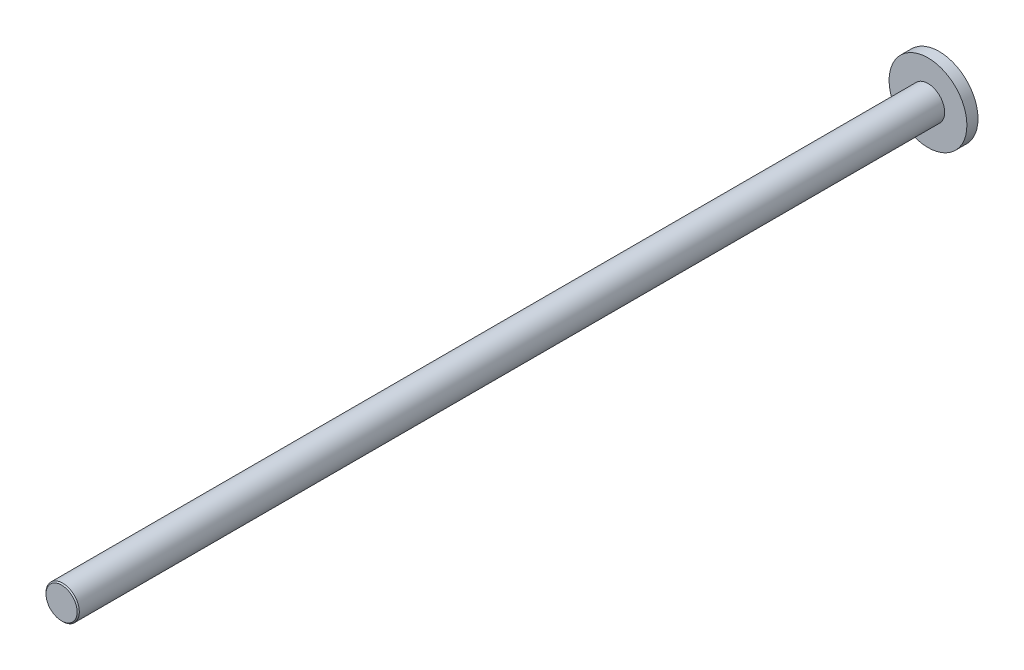
ISO-10303-21;
HEADER;
FILE_DESCRIPTION(('STEP AP214'),'2;1');
FILE_NAME('part.step','',(''),(''),'','','');
FILE_SCHEMA(('AUTOMOTIVE_DESIGN { 1 0 10303 214 1 1 1 1 }'));
ENDSEC;
DATA;
#1=APPLICATION_CONTEXT('core data for automotive mechanical design processes');
#2=APPLICATION_PROTOCOL_DEFINITION('international standard','automotive_design',2000,#1);
#3=PRODUCT_CONTEXT('',#1,'mechanical');
#4=PRODUCT('Part','Part','',(#3));
#5=PRODUCT_RELATED_PRODUCT_CATEGORY('part','',(#4));
#6=PRODUCT_DEFINITION_FORMATION('','',#4);
#7=PRODUCT_DEFINITION_CONTEXT('part definition',#1,'design');
#8=PRODUCT_DEFINITION('design','',#6,#7);
#9=PRODUCT_DEFINITION_SHAPE('','',#8);
#10=(LENGTH_UNIT() NAMED_UNIT(*) SI_UNIT(.MILLI.,.METRE.));
#11=(NAMED_UNIT(*) PLANE_ANGLE_UNIT() SI_UNIT($,.RADIAN.));
#12=(NAMED_UNIT(*) SI_UNIT($,.STERADIAN.) SOLID_ANGLE_UNIT());
#13=UNCERTAINTY_MEASURE_WITH_UNIT(LENGTH_MEASURE(1.E-05),#10,'distance_accuracy_value','');
#14=(GEOMETRIC_REPRESENTATION_CONTEXT(3) GLOBAL_UNCERTAINTY_ASSIGNED_CONTEXT((#13)) GLOBAL_UNIT_ASSIGNED_CONTEXT((#10,
#11,#12)) REPRESENTATION_CONTEXT('',''));
#15=CARTESIAN_POINT('',(0.,0.,0.));
#16=DIRECTION('',(0.,0.,1.));
#17=DIRECTION('',(1.,0.,0.));
#18=AXIS2_PLACEMENT_3D('',#15,#16,#17);
#19=CARTESIAN_POINT('',(0.,0.,1.));
#20=DIRECTION('',(0.,0.,-1.));
#21=DIRECTION('',(-1.,0.,0.));
#22=AXIS2_PLACEMENT_3D('',#19,#20,#21);
#23=CYLINDRICAL_SURFACE('',#22,3.5);
#24=CARTESIAN_POINT('',(0.,0.,1.));
#25=DIRECTION('',(0.,0.,1.));
#26=DIRECTION('',(1.,0.,0.));
#27=AXIS2_PLACEMENT_3D('',#24,#25,#26);
#28=CIRCLE('',#27,3.5);
#29=CARTESIAN_POINT('',(3.5,0.,1.));
#30=VERTEX_POINT('',#29);
#31=EDGE_CURVE('E74',#30,#30,#28,.T.);
#32=ORIENTED_EDGE('',*,*,#31,.F.);
#33=EDGE_LOOP('',(#32));
#34=FACE_BOUND('',#33,.T.);
#35=CARTESIAN_POINT('',(0.,0.,0.));
#36=DIRECTION('',(0.,0.,1.));
#37=DIRECTION('',(1.,0.,0.));
#38=AXIS2_PLACEMENT_3D('',#35,#36,#37);
#39=CIRCLE('',#38,3.5);
#40=CARTESIAN_POINT('',(3.5,0.,0.));
#41=VERTEX_POINT('',#40);
#42=EDGE_CURVE('E77',#41,#41,#39,.T.);
#43=ORIENTED_EDGE('',*,*,#42,.T.);
#44=EDGE_LOOP('',(#43));
#45=FACE_BOUND('',#44,.T.);
#46=ADVANCED_FACE('F51',(#34,#45),#23,.T.);
#47=CARTESIAN_POINT('',(0.,0.,1.));
#48=DIRECTION('',(0.,0.,1.));
#49=DIRECTION('',(1.,0.,0.));
#50=AXIS2_PLACEMENT_3D('',#47,#48,#49);
#51=PLANE('',#50);
#52=CARTESIAN_POINT('',(0.,0.,1.));
#53=DIRECTION('',(0.,0.,1.));
#54=DIRECTION('',(1.,0.,0.));
#55=AXIS2_PLACEMENT_3D('',#52,#53,#54);
#56=CIRCLE('',#55,1.5);
#57=CARTESIAN_POINT('',(1.5,0.,1.));
#58=VERTEX_POINT('',#57);
#59=EDGE_CURVE('E67',#58,#58,#56,.T.);
#60=ORIENTED_EDGE('',*,*,#59,.F.);
#61=EDGE_LOOP('',(#60));
#62=FACE_BOUND('',#61,.T.);
#63=ORIENTED_EDGE('',*,*,#31,.T.);
#64=EDGE_LOOP('',(#63));
#65=FACE_BOUND('',#64,.T.);
#66=ADVANCED_FACE('F84',(#62,#65),#51,.T.);
#67=CARTESIAN_POINT('',(0.,0.,0.));
#68=DIRECTION('',(0.,0.,1.));
#69=DIRECTION('',(1.,0.,0.));
#70=AXIS2_PLACEMENT_3D('',#67,#68,#69);
#71=PLANE('',#70);
#72=ORIENTED_EDGE('',*,*,#42,.F.);
#73=EDGE_LOOP('',(#72));
#74=FACE_BOUND('',#73,.T.);
#75=ADVANCED_FACE('F90',(#74),#71,.F.);
#76=CARTESIAN_POINT('',(-4.44089209850063E-13,0.,79.));
#77=DIRECTION('',(0.,0.,-1.));
#78=DIRECTION('',(-1.,0.,0.));
#79=AXIS2_PLACEMENT_3D('',#76,#77,#78);
#80=CYLINDRICAL_SURFACE('',#79,1.5);
#81=CARTESIAN_POINT('',(-4.44089209850063E-13,0.,78.9));
#82=DIRECTION('',(0.,0.,1.));
#83=DIRECTION('',(1.,0.,0.));
#84=AXIS2_PLACEMENT_3D('',#81,#82,#83);
#85=CIRCLE('',#84,1.5);
#86=CARTESIAN_POINT('',(-1.50000000000045,0.,78.9));
#87=VERTEX_POINT('',#86);
#88=EDGE_CURVE('E10',#87,#87,#85,.F.);
#89=ORIENTED_EDGE('',*,*,#88,.T.);
#90=EDGE_LOOP('',(#89));
#91=FACE_BOUND('',#90,.T.);
#92=ORIENTED_EDGE('',*,*,#59,.T.);
#93=EDGE_LOOP('',(#92));
#94=FACE_BOUND('',#93,.T.);
#95=ADVANCED_FACE('F92',(#91,#94),#80,.T.);
#96=CARTESIAN_POINT('',(-4.44089209850063E-13,0.,79.));
#97=DIRECTION('',(0.,0.,1.));
#98=DIRECTION('',(1.,0.,0.));
#99=AXIS2_PLACEMENT_3D('',#96,#97,#98);
#100=PLANE('',#99);
#101=CARTESIAN_POINT('',(-4.44089209850063E-13,0.,79.));
#102=DIRECTION('',(0.,0.,1.));
#103=DIRECTION('',(1.,0.,0.));
#104=AXIS2_PLACEMENT_3D('',#101,#102,#103);
#105=CIRCLE('',#104,1.40000000000001);
#106=CARTESIAN_POINT('',(-1.40000000000046,0.,79.));
#107=VERTEX_POINT('',#106);
#108=EDGE_CURVE('E60',#107,#107,#105,.T.);
#109=ORIENTED_EDGE('',*,*,#108,.T.);
#110=EDGE_LOOP('',(#109));
#111=FACE_BOUND('',#110,.T.);
#112=ADVANCED_FACE('F97',(#111),#100,.T.);
#113=CARTESIAN_POINT('',(-4.44089209850063E-13,0.,79.));
#114=DIRECTION('',(0.,0.,-1.));
#115=DIRECTION('',(-1.,0.,0.));
#116=AXIS2_PLACEMENT_3D('',#113,#114,#115);
#117=CONICAL_SURFACE('',#116,1.40000000000001,0.785398163397444);
#118=CARTESIAN_POINT('',(-1.50000000000045,0.,78.9));
#119=CARTESIAN_POINT('',(-1.49895833333379,0.,78.9010416666667));
#120=CARTESIAN_POINT('',(-1.49791666666712,0.,78.9020833333334));
#121=CARTESIAN_POINT('',(-1.49583333333378,0.,78.9041666666667));
#122=CARTESIAN_POINT('',(-1.49479166666712,0.,78.9052083333333));
#123=CARTESIAN_POINT('',(-1.49270833333378,0.,78.9072916666667));
#124=CARTESIAN_POINT('',(-1.49166666666712,0.,78.9083333333333));
#125=CARTESIAN_POINT('',(-1.48958333333379,0.,78.9104166666667));
#126=CARTESIAN_POINT('',(-1.48854166666712,0.,78.9114583333334));
#127=CARTESIAN_POINT('',(-1.48645833333379,0.,78.9135416666667));
#128=CARTESIAN_POINT('',(-1.48541666666712,0.,78.9145833333333));
#129=CARTESIAN_POINT('',(-1.48333333333379,0.,78.9166666666667));
#130=CARTESIAN_POINT('',(-1.48229166666712,0.,78.9177083333334));
#131=CARTESIAN_POINT('',(-1.48020833333379,0.,78.9197916666667));
#132=CARTESIAN_POINT('',(-1.47916666666712,0.,78.9208333333333));
#133=CARTESIAN_POINT('',(-1.47708333333379,0.,78.9229166666667));
#134=CARTESIAN_POINT('',(-1.47604166666712,0.,78.9239583333333));
#135=CARTESIAN_POINT('',(-1.47395833333379,0.,78.9260416666667));
#136=CARTESIAN_POINT('',(-1.47291666666712,0.,78.9270833333333));
#137=CARTESIAN_POINT('',(-1.47083333333379,0.,78.9291666666667));
#138=CARTESIAN_POINT('',(-1.46979166666712,0.,78.9302083333334));
#139=CARTESIAN_POINT('',(-1.46770833333379,0.,78.9322916666667));
#140=CARTESIAN_POINT('',(-1.46666666666712,0.,78.9333333333333));
#141=CARTESIAN_POINT('',(-1.46458333333379,0.,78.9354166666667));
#142=CARTESIAN_POINT('',(-1.46354166666712,0.,78.9364583333333));
#143=CARTESIAN_POINT('',(-1.46145833333379,0.,78.9385416666667));
#144=CARTESIAN_POINT('',(-1.46041666666712,0.,78.9395833333334));
#145=CARTESIAN_POINT('',(-1.45833333333379,0.,78.9416666666667));
#146=CARTESIAN_POINT('',(-1.45729166666712,0.,78.9427083333333));
#147=CARTESIAN_POINT('',(-1.45520833333379,0.,78.9447916666667));
#148=CARTESIAN_POINT('',(-1.45416666666712,0.,78.9458333333333));
#149=CARTESIAN_POINT('',(-1.45208333333379,0.,78.9479166666667));
#150=CARTESIAN_POINT('',(-1.45104166666712,0.,78.9489583333334));
#151=CARTESIAN_POINT('',(-1.44895833333379,0.,78.9510416666667));
#152=CARTESIAN_POINT('',(-1.44791666666713,0.,78.9520833333333));
#153=CARTESIAN_POINT('',(-1.44583333333379,0.,78.9541666666667));
#154=CARTESIAN_POINT('',(-1.44479166666712,0.,78.9552083333333));
#155=CARTESIAN_POINT('',(-1.44270833333379,0.,78.9572916666667));
#156=CARTESIAN_POINT('',(-1.44166666666713,0.,78.9583333333333));
#157=CARTESIAN_POINT('',(-1.43958333333379,0.,78.9604166666667));
#158=CARTESIAN_POINT('',(-1.43854166666712,0.,78.9614583333333));
#159=CARTESIAN_POINT('',(-1.43645833333379,0.,78.9635416666667));
#160=CARTESIAN_POINT('',(-1.43541666666713,0.,78.9645833333333));
#161=CARTESIAN_POINT('',(-1.43333333333379,0.,78.9666666666667));
#162=CARTESIAN_POINT('',(-1.43229166666713,0.,78.9677083333333));
#163=CARTESIAN_POINT('',(-1.43020833333379,0.,78.9697916666667));
#164=CARTESIAN_POINT('',(-1.42916666666713,0.,78.9708333333333));
#165=CARTESIAN_POINT('',(-1.42708333333379,0.,78.9729166666667));
#166=CARTESIAN_POINT('',(-1.42604166666713,0.,78.9739583333333));
#167=CARTESIAN_POINT('',(-1.42395833333379,0.,78.9760416666667));
#168=CARTESIAN_POINT('',(-1.42291666666713,0.,78.9770833333334));
#169=CARTESIAN_POINT('',(-1.42083333333379,0.,78.9791666666667));
#170=CARTESIAN_POINT('',(-1.41979166666713,0.,78.9802083333333));
#171=CARTESIAN_POINT('',(-1.4177083333338,0.,78.9822916666667));
#172=CARTESIAN_POINT('',(-1.41666666666713,0.,78.9833333333333));
#173=CARTESIAN_POINT('',(-1.41458333333379,0.,78.9854166666667));
#174=CARTESIAN_POINT('',(-1.41354166666713,0.,78.9864583333333));
#175=CARTESIAN_POINT('',(-1.4114583333338,0.,78.9885416666667));
#176=CARTESIAN_POINT('',(-1.41041666666713,0.,78.9895833333333));
#177=CARTESIAN_POINT('',(-1.40833333333379,0.,78.9916666666667));
#178=CARTESIAN_POINT('',(-1.40729166666713,0.,78.9927083333333));
#179=CARTESIAN_POINT('',(-1.4052083333338,0.,78.9947916666667));
#180=CARTESIAN_POINT('',(-1.40416666666713,0.,78.9958333333334));
#181=CARTESIAN_POINT('',(-1.40208333333379,0.,78.9979166666667));
#182=CARTESIAN_POINT('',(-1.40104166666713,0.,78.9989583333333));
#183=CARTESIAN_POINT('',(-1.40000000000046,0.,79.));
#184=B_SPLINE_CURVE_WITH_KNOTS('',3,(#118,#119,#120,#121,#122,#123,#124,#125,#126,#127,#128,
#129,#130,#131,#132,#133,#134,#135,#136,#137,#138,#139,#140,#141,#142,#143,#144,#145,#146,#147,
#148,#149,#150,#151,#152,#153,#154,#155,#156,#157,#158,#159,#160,#161,#162,#163,#164,#165,#166,
#167,#168,#169,#170,#171,#172,#173,#174,#175,#176,#177,#178,#179,#180,#181,#182,#183),
.UNSPECIFIED.,.F.,.F.,(4,2,2,2,2,2,2,2,2,2,2,2,2,2,2,2,2,2,2,2,2,2,2,2,2,2,2,2,2,2,2,2,4),(0.,
0.00441941738242034,0.00883883476483087,0.0132582521472512,0.0176776695296616,
0.0220970869120819,0.0265165042944925,0.0309359216769128,0.0353553390593233,0.0397747564417437,
0.0441941738241542,0.0486135912065745,0.0530330085889947,0.0574524259714052,0.0618718433538158,
0.0662912607362361,0.0707106781186467,0.075130095501067,0.0795495128834775,0.0839689302658979,
0.0883883476483083,0.0928077650307286,0.0972271824131391,0.101646599795559,0.10606601717798,
0.11048543456039,0.114904851942811,0.119324269325221,0.123743686707642,0.128163104090052,
0.132582521472472,0.137001938854883,0.141421356237303),.UNSPECIFIED.);
#185=EDGE_CURVE('BSEAM54',#87,#107,#184,.T.);
#186=ORIENTED_EDGE('',*,*,#88,.F.);
#187=ORIENTED_EDGE('',*,*,#108,.F.);
#188=ORIENTED_EDGE('',*,*,#185,.T.);
#189=ORIENTED_EDGE('',*,*,#185,.F.);
#190=EDGE_LOOP('',(#186,#188,#187,#189));
#191=FACE_BOUND('',#190,.T.);
#192=ADVANCED_FACE('F54',(#191),#117,.T.);
#193=CLOSED_SHELL('',(#46,#66,#75,#95,#112,#192));
#194=MANIFOLD_SOLID_BREP('B2',#193);
#195=ADVANCED_BREP_SHAPE_REPRESENTATION('',(#18,#194),#14);
#196=SHAPE_DEFINITION_REPRESENTATION(#9,#195);
ENDSEC;
END-ISO-10303-21;
